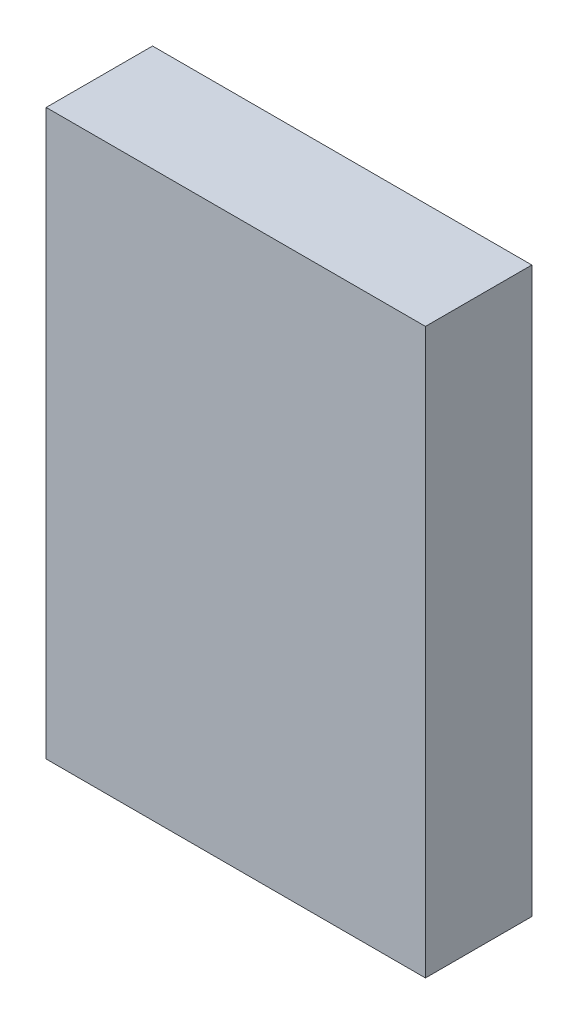
ISO-10303-21;
HEADER;
FILE_DESCRIPTION(('STEP AP214'),'2;1');
FILE_NAME('part.step','',(''),(''),'','','');
FILE_SCHEMA(('AUTOMOTIVE_DESIGN { 1 0 10303 214 1 1 1 1 }'));
ENDSEC;
DATA;
#1=APPLICATION_CONTEXT('core data for automotive mechanical design processes');
#2=APPLICATION_PROTOCOL_DEFINITION('international standard','automotive_design',2000,#1);
#3=PRODUCT_CONTEXT('',#1,'mechanical');
#4=PRODUCT('Part','Part','',(#3));
#5=PRODUCT_RELATED_PRODUCT_CATEGORY('part','',(#4));
#6=PRODUCT_DEFINITION_FORMATION('','',#4);
#7=PRODUCT_DEFINITION_CONTEXT('part definition',#1,'design');
#8=PRODUCT_DEFINITION('design','',#6,#7);
#9=PRODUCT_DEFINITION_SHAPE('','',#8);
#10=(LENGTH_UNIT() NAMED_UNIT(*) SI_UNIT(.MILLI.,.METRE.));
#11=(NAMED_UNIT(*) PLANE_ANGLE_UNIT() SI_UNIT($,.RADIAN.));
#12=(NAMED_UNIT(*) SI_UNIT($,.STERADIAN.) SOLID_ANGLE_UNIT());
#13=UNCERTAINTY_MEASURE_WITH_UNIT(LENGTH_MEASURE(1.E-05),#10,'distance_accuracy_value','');
#14=(GEOMETRIC_REPRESENTATION_CONTEXT(3) GLOBAL_UNCERTAINTY_ASSIGNED_CONTEXT((#13)) GLOBAL_UNIT_ASSIGNED_CONTEXT((#10,
#11,#12)) REPRESENTATION_CONTEXT('',''));
#15=CARTESIAN_POINT('',(0.,0.,0.));
#16=DIRECTION('',(0.,0.,1.));
#17=DIRECTION('',(1.,0.,0.));
#18=AXIS2_PLACEMENT_3D('',#15,#16,#17);
#19=CARTESIAN_POINT('',(-41.,61.,-23.));
#20=DIRECTION('',(-1.,0.,0.));
#21=DIRECTION('',(0.,-1.,0.));
#22=AXIS2_PLACEMENT_3D('',#19,#20,#21);
#23=PLANE('',#22);
#24=DIRECTION('',(0.,-1.,0.));
#25=VECTOR('',#24,1.);
#26=CARTESIAN_POINT('',(-41.,61.,0.));
#27=LINE('',#26,#25);
#28=CARTESIAN_POINT('',(-41.,61.,0.));
#29=VERTEX_POINT('',#28);
#30=CARTESIAN_POINT('',(-41.,-61.,0.));
#31=VERTEX_POINT('',#30);
#32=EDGE_CURVE('E189',#29,#31,#27,.T.);
#33=ORIENTED_EDGE('',*,*,#32,.F.);
#34=DIRECTION('',(0.,0.,1.));
#35=VECTOR('',#34,1.);
#36=CARTESIAN_POINT('',(-41.,61.,-23.));
#37=LINE('',#36,#35);
#38=CARTESIAN_POINT('',(-41.,61.,-23.));
#39=VERTEX_POINT('',#38);
#40=EDGE_CURVE('E42',#39,#29,#37,.T.);
#41=ORIENTED_EDGE('',*,*,#40,.F.);
#42=DIRECTION('',(0.,-1.,0.));
#43=VECTOR('',#42,1.);
#44=CARTESIAN_POINT('',(-41.,61.,-23.));
#45=LINE('',#44,#43);
#46=CARTESIAN_POINT('',(-41.,-61.,-23.));
#47=VERTEX_POINT('',#46);
#48=EDGE_CURVE('E190',#39,#47,#45,.T.);
#49=ORIENTED_EDGE('',*,*,#48,.T.);
#50=DIRECTION('',(0.,0.,1.));
#51=VECTOR('',#50,1.);
#52=CARTESIAN_POINT('',(-41.,-61.,-23.));
#53=LINE('',#52,#51);
#54=EDGE_CURVE('E203',#47,#31,#53,.T.);
#55=ORIENTED_EDGE('',*,*,#54,.T.);
#56=EDGE_LOOP('',(#33,#41,#49,#55));
#57=FACE_BOUND('',#56,.T.);
#58=ADVANCED_FACE('F35',(#57),#23,.T.);
#59=CARTESIAN_POINT('',(-41.,61.,-23.));
#60=DIRECTION('',(0.,1.,0.));
#61=DIRECTION('',(0.,0.,1.));
#62=AXIS2_PLACEMENT_3D('',#59,#60,#61);
#63=PLANE('',#62);
#64=DIRECTION('',(-1.,0.,0.));
#65=VECTOR('',#64,1.);
#66=CARTESIAN_POINT('',(-41.,61.,0.));
#67=LINE('',#66,#65);
#68=CARTESIAN_POINT('',(41.,61.,0.));
#69=VERTEX_POINT('',#68);
#70=EDGE_CURVE('E194',#69,#29,#67,.T.);
#71=ORIENTED_EDGE('',*,*,#70,.F.);
#72=DIRECTION('',(0.,0.,1.));
#73=VECTOR('',#72,1.);
#74=CARTESIAN_POINT('',(41.,61.,-23.));
#75=LINE('',#74,#73);
#76=CARTESIAN_POINT('',(41.,61.,-23.));
#77=VERTEX_POINT('',#76);
#78=EDGE_CURVE('E215',#77,#69,#75,.T.);
#79=ORIENTED_EDGE('',*,*,#78,.F.);
#80=DIRECTION('',(-1.,0.,0.));
#81=VECTOR('',#80,1.);
#82=CARTESIAN_POINT('',(-41.,61.,-23.));
#83=LINE('',#82,#81);
#84=EDGE_CURVE('E200',#77,#39,#83,.T.);
#85=ORIENTED_EDGE('',*,*,#84,.T.);
#86=ORIENTED_EDGE('',*,*,#40,.T.);
#87=EDGE_LOOP('',(#71,#79,#85,#86));
#88=FACE_BOUND('',#87,.T.);
#89=ADVANCED_FACE('F230',(#88),#63,.T.);
#90=CARTESIAN_POINT('',(41.,61.,-23.));
#91=DIRECTION('',(1.,0.,0.));
#92=DIRECTION('',(0.,1.,0.));
#93=AXIS2_PLACEMENT_3D('',#90,#91,#92);
#94=PLANE('',#93);
#95=DIRECTION('',(0.,1.,0.));
#96=VECTOR('',#95,1.);
#97=CARTESIAN_POINT('',(41.,61.,0.));
#98=LINE('',#97,#96);
#99=CARTESIAN_POINT('',(41.,-61.,0.));
#100=VERTEX_POINT('',#99);
#101=EDGE_CURVE('E209',#100,#69,#98,.T.);
#102=ORIENTED_EDGE('',*,*,#101,.F.);
#103=DIRECTION('',(0.,0.,1.));
#104=VECTOR('',#103,1.);
#105=CARTESIAN_POINT('',(41.,-61.,-23.));
#106=LINE('',#105,#104);
#107=CARTESIAN_POINT('',(41.,-61.,-23.));
#108=VERTEX_POINT('',#107);
#109=EDGE_CURVE('E217',#108,#100,#106,.T.);
#110=ORIENTED_EDGE('',*,*,#109,.F.);
#111=DIRECTION('',(0.,1.,0.));
#112=VECTOR('',#111,1.);
#113=CARTESIAN_POINT('',(41.,61.,-23.));
#114=LINE('',#113,#112);
#115=EDGE_CURVE('E197',#108,#77,#114,.T.);
#116=ORIENTED_EDGE('',*,*,#115,.T.);
#117=ORIENTED_EDGE('',*,*,#78,.T.);
#118=EDGE_LOOP('',(#102,#110,#116,#117));
#119=FACE_BOUND('',#118,.T.);
#120=ADVANCED_FACE('F236',(#119),#94,.T.);
#121=CARTESIAN_POINT('',(-41.,-61.,-23.));
#122=DIRECTION('',(0.,-1.,0.));
#123=DIRECTION('',(0.,0.,-1.));
#124=AXIS2_PLACEMENT_3D('',#121,#122,#123);
#125=PLANE('',#124);
#126=DIRECTION('',(1.,0.,0.));
#127=VECTOR('',#126,1.);
#128=CARTESIAN_POINT('',(-41.,-61.,0.));
#129=LINE('',#128,#127);
#130=EDGE_CURVE('E206',#31,#100,#129,.T.);
#131=ORIENTED_EDGE('',*,*,#130,.F.);
#132=ORIENTED_EDGE('',*,*,#54,.F.);
#133=DIRECTION('',(1.,0.,0.));
#134=VECTOR('',#133,1.);
#135=CARTESIAN_POINT('',(-41.,-61.,-23.));
#136=LINE('',#135,#134);
#137=EDGE_CURVE('E193',#47,#108,#136,.T.);
#138=ORIENTED_EDGE('',*,*,#137,.T.);
#139=ORIENTED_EDGE('',*,*,#109,.T.);
#140=EDGE_LOOP('',(#131,#132,#138,#139));
#141=FACE_BOUND('',#140,.T.);
#142=ADVANCED_FACE('F224',(#141),#125,.T.);
#143=CARTESIAN_POINT('',(0.,0.,-23.));
#144=DIRECTION('',(0.,0.,1.));
#145=DIRECTION('',(1.,0.,0.));
#146=AXIS2_PLACEMENT_3D('',#143,#144,#145);
#147=PLANE('',#146);
#148=DIRECTION('',(-1.,0.,0.));
#149=VECTOR('',#148,1.);
#150=CARTESIAN_POINT('',(39.,-59.,-23.));
#151=LINE('',#150,#149);
#152=CARTESIAN_POINT('',(39.,-59.,-23.));
#153=VERTEX_POINT('',#152);
#154=CARTESIAN_POINT('',(-39.,-59.,-23.));
#155=VERTEX_POINT('',#154);
#156=EDGE_CURVE('E151',#153,#155,#151,.T.);
#157=ORIENTED_EDGE('',*,*,#156,.F.);
#158=DIRECTION('',(0.,-1.,0.));
#159=VECTOR('',#158,1.);
#160=CARTESIAN_POINT('',(39.,59.,-23.));
#161=LINE('',#160,#159);
#162=CARTESIAN_POINT('',(39.,59.,-23.));
#163=VERTEX_POINT('',#162);
#164=EDGE_CURVE('E49',#163,#153,#161,.T.);
#165=ORIENTED_EDGE('',*,*,#164,.F.);
#166=DIRECTION('',(1.,0.,0.));
#167=VECTOR('',#166,1.);
#168=CARTESIAN_POINT('',(39.,59.,-23.));
#169=LINE('',#168,#167);
#170=CARTESIAN_POINT('',(-39.,59.,-23.));
#171=VERTEX_POINT('',#170);
#172=EDGE_CURVE('E142',#171,#163,#169,.T.);
#173=ORIENTED_EDGE('',*,*,#172,.F.);
#174=DIRECTION('',(0.,1.,0.));
#175=VECTOR('',#174,1.);
#176=CARTESIAN_POINT('',(-39.,59.,-23.));
#177=LINE('',#176,#175);
#178=EDGE_CURVE('E145',#155,#171,#177,.T.);
#179=ORIENTED_EDGE('',*,*,#178,.F.);
#180=EDGE_LOOP('',(#157,#165,#173,#179));
#181=FACE_BOUND('',#180,.T.);
#182=ORIENTED_EDGE('',*,*,#48,.F.);
#183=ORIENTED_EDGE('',*,*,#84,.F.);
#184=ORIENTED_EDGE('',*,*,#115,.F.);
#185=ORIENTED_EDGE('',*,*,#137,.F.);
#186=EDGE_LOOP('',(#182,#183,#184,#185));
#187=FACE_BOUND('',#186,.T.);
#188=ADVANCED_FACE('F233',(#181,#187),#147,.F.);
#189=CARTESIAN_POINT('',(0.,0.,0.));
#190=DIRECTION('',(0.,0.,1.));
#191=DIRECTION('',(1.,0.,0.));
#192=AXIS2_PLACEMENT_3D('',#189,#190,#191);
#193=PLANE('',#192);
#194=ORIENTED_EDGE('',*,*,#32,.T.);
#195=ORIENTED_EDGE('',*,*,#130,.T.);
#196=ORIENTED_EDGE('',*,*,#101,.T.);
#197=ORIENTED_EDGE('',*,*,#70,.T.);
#198=EDGE_LOOP('',(#194,#195,#196,#197));
#199=FACE_BOUND('',#198,.T.);
#200=ADVANCED_FACE('F227',(#199),#193,.T.);
#201=CARTESIAN_POINT('',(0.,0.,-21.));
#202=DIRECTION('',(0.,0.,-1.));
#203=DIRECTION('',(-1.,0.,0.));
#204=AXIS2_PLACEMENT_3D('',#201,#202,#203);
#205=PLANE('',#204);
#206=DIRECTION('',(0.,-1.,0.));
#207=VECTOR('',#206,1.);
#208=CARTESIAN_POINT('',(39.,59.,-21.));
#209=LINE('',#208,#207);
#210=CARTESIAN_POINT('',(39.,59.,-21.));
#211=VERTEX_POINT('',#210);
#212=CARTESIAN_POINT('',(39.,-59.,-21.));
#213=VERTEX_POINT('',#212);
#214=EDGE_CURVE('E124',#211,#213,#209,.T.);
#215=ORIENTED_EDGE('',*,*,#214,.T.);
#216=DIRECTION('',(-1.,0.,0.));
#217=VECTOR('',#216,1.);
#218=CARTESIAN_POINT('',(39.,-59.,-21.));
#219=LINE('',#218,#217);
#220=CARTESIAN_POINT('',(-39.,-59.,-21.));
#221=VERTEX_POINT('',#220);
#222=EDGE_CURVE('E133',#213,#221,#219,.T.);
#223=ORIENTED_EDGE('',*,*,#222,.T.);
#224=DIRECTION('',(0.,1.,0.));
#225=VECTOR('',#224,1.);
#226=CARTESIAN_POINT('',(-39.,59.,-21.));
#227=LINE('',#226,#225);
#228=CARTESIAN_POINT('',(-39.,59.,-21.));
#229=VERTEX_POINT('',#228);
#230=EDGE_CURVE('E138',#221,#229,#227,.T.);
#231=ORIENTED_EDGE('',*,*,#230,.T.);
#232=DIRECTION('',(1.,0.,0.));
#233=VECTOR('',#232,1.);
#234=CARTESIAN_POINT('',(39.,59.,-21.));
#235=LINE('',#234,#233);
#236=EDGE_CURVE('E130',#229,#211,#235,.T.);
#237=ORIENTED_EDGE('',*,*,#236,.T.);
#238=EDGE_LOOP('',(#215,#223,#231,#237));
#239=FACE_BOUND('',#238,.T.);
#240=DIRECTION('',(-1.,0.,0.));
#241=VECTOR('',#240,1.);
#242=CARTESIAN_POINT('',(38.,58.,-21.));
#243=LINE('',#242,#241);
#244=CARTESIAN_POINT('',(38.,58.,-21.));
#245=VERTEX_POINT('',#244);
#246=CARTESIAN_POINT('',(-38.,58.,-21.));
#247=VERTEX_POINT('',#246);
#248=EDGE_CURVE('E56',#245,#247,#243,.T.);
#249=ORIENTED_EDGE('',*,*,#248,.T.);
#250=DIRECTION('',(0.,-1.,0.));
#251=VECTOR('',#250,1.);
#252=CARTESIAN_POINT('',(-38.,58.,-21.));
#253=LINE('',#252,#251);
#254=CARTESIAN_POINT('',(-38.,-58.,-21.));
#255=VERTEX_POINT('',#254);
#256=EDGE_CURVE('E12',#247,#255,#253,.T.);
#257=ORIENTED_EDGE('',*,*,#256,.T.);
#258=DIRECTION('',(1.,0.,0.));
#259=VECTOR('',#258,1.);
#260=CARTESIAN_POINT('',(38.,-58.,-21.));
#261=LINE('',#260,#259);
#262=CARTESIAN_POINT('',(38.,-58.,-21.));
#263=VERTEX_POINT('',#262);
#264=EDGE_CURVE('E157',#255,#263,#261,.T.);
#265=ORIENTED_EDGE('',*,*,#264,.T.);
#266=DIRECTION('',(0.,1.,0.));
#267=VECTOR('',#266,1.);
#268=CARTESIAN_POINT('',(38.,58.,-21.));
#269=LINE('',#268,#267);
#270=EDGE_CURVE('E162',#263,#245,#269,.T.);
#271=ORIENTED_EDGE('',*,*,#270,.T.);
#272=EDGE_LOOP('',(#249,#257,#265,#271));
#273=FACE_BOUND('',#272,.T.);
#274=ADVANCED_FACE('F140',(#239,#273),#205,.T.);
#275=CARTESIAN_POINT('',(39.,59.,-21.));
#276=DIRECTION('',(1.,0.,0.));
#277=DIRECTION('',(0.,1.,0.));
#278=AXIS2_PLACEMENT_3D('',#275,#276,#277);
#279=PLANE('',#278);
#280=ORIENTED_EDGE('',*,*,#164,.T.);
#281=DIRECTION('',(0.,0.,-1.));
#282=VECTOR('',#281,1.);
#283=CARTESIAN_POINT('',(39.,-59.,-21.));
#284=LINE('',#283,#282);
#285=EDGE_CURVE('E120',#213,#153,#284,.T.);
#286=ORIENTED_EDGE('',*,*,#285,.F.);
#287=ORIENTED_EDGE('',*,*,#214,.F.);
#288=DIRECTION('',(0.,0.,-1.));
#289=VECTOR('',#288,1.);
#290=CARTESIAN_POINT('',(39.,59.,-21.));
#291=LINE('',#290,#289);
#292=EDGE_CURVE('E155',#211,#163,#291,.T.);
#293=ORIENTED_EDGE('',*,*,#292,.T.);
#294=EDGE_LOOP('',(#280,#286,#287,#293));
#295=FACE_BOUND('',#294,.T.);
#296=ADVANCED_FACE('F122',(#295),#279,.F.);
#297=CARTESIAN_POINT('',(39.,59.,-21.));
#298=DIRECTION('',(0.,1.,0.));
#299=DIRECTION('',(0.,0.,1.));
#300=AXIS2_PLACEMENT_3D('',#297,#298,#299);
#301=PLANE('',#300);
#302=ORIENTED_EDGE('',*,*,#172,.T.);
#303=ORIENTED_EDGE('',*,*,#292,.F.);
#304=ORIENTED_EDGE('',*,*,#236,.F.);
#305=DIRECTION('',(0.,0.,-1.));
#306=VECTOR('',#305,1.);
#307=CARTESIAN_POINT('',(-39.,59.,-21.));
#308=LINE('',#307,#306);
#309=EDGE_CURVE('E158',#229,#171,#308,.T.);
#310=ORIENTED_EDGE('',*,*,#309,.T.);
#311=EDGE_LOOP('',(#302,#303,#304,#310));
#312=FACE_BOUND('',#311,.T.);
#313=ADVANCED_FACE('F310',(#312),#301,.F.);
#314=CARTESIAN_POINT('',(-39.,59.,-21.));
#315=DIRECTION('',(-1.,0.,0.));
#316=DIRECTION('',(0.,-1.,0.));
#317=AXIS2_PLACEMENT_3D('',#314,#315,#316);
#318=PLANE('',#317);
#319=ORIENTED_EDGE('',*,*,#178,.T.);
#320=ORIENTED_EDGE('',*,*,#309,.F.);
#321=ORIENTED_EDGE('',*,*,#230,.F.);
#322=DIRECTION('',(0.,0.,-1.));
#323=VECTOR('',#322,1.);
#324=CARTESIAN_POINT('',(-39.,-59.,-21.));
#325=LINE('',#324,#323);
#326=EDGE_CURVE('E129',#221,#155,#325,.T.);
#327=ORIENTED_EDGE('',*,*,#326,.T.);
#328=EDGE_LOOP('',(#319,#320,#321,#327));
#329=FACE_BOUND('',#328,.T.);
#330=ADVANCED_FACE('F319',(#329),#318,.F.);
#331=CARTESIAN_POINT('',(39.,-59.,-21.));
#332=DIRECTION('',(0.,-1.,0.));
#333=DIRECTION('',(0.,0.,-1.));
#334=AXIS2_PLACEMENT_3D('',#331,#332,#333);
#335=PLANE('',#334);
#336=ORIENTED_EDGE('',*,*,#156,.T.);
#337=ORIENTED_EDGE('',*,*,#326,.F.);
#338=ORIENTED_EDGE('',*,*,#222,.F.);
#339=ORIENTED_EDGE('',*,*,#285,.T.);
#340=EDGE_LOOP('',(#336,#337,#338,#339));
#341=FACE_BOUND('',#340,.T.);
#342=ADVANCED_FACE('F134',(#341),#335,.F.);
#343=CARTESIAN_POINT('',(0.,0.,-2.));
#344=DIRECTION('',(0.,0.,1.));
#345=DIRECTION('',(1.,0.,0.));
#346=AXIS2_PLACEMENT_3D('',#343,#344,#345);
#347=PLANE('',#346);
#348=DIRECTION('',(0.,1.,0.));
#349=VECTOR('',#348,1.);
#350=CARTESIAN_POINT('',(-38.,58.,-2.));
#351=LINE('',#350,#349);
#352=CARTESIAN_POINT('',(-38.,-58.,-2.));
#353=VERTEX_POINT('',#352);
#354=CARTESIAN_POINT('',(-38.,58.,-2.));
#355=VERTEX_POINT('',#354);
#356=EDGE_CURVE('E169',#353,#355,#351,.T.);
#357=ORIENTED_EDGE('',*,*,#356,.T.);
#358=DIRECTION('',(1.,0.,0.));
#359=VECTOR('',#358,1.);
#360=CARTESIAN_POINT('',(38.,58.,-2.));
#361=LINE('',#360,#359);
#362=CARTESIAN_POINT('',(38.,58.,-2.));
#363=VERTEX_POINT('',#362);
#364=EDGE_CURVE('E165',#355,#363,#361,.T.);
#365=ORIENTED_EDGE('',*,*,#364,.T.);
#366=DIRECTION('',(0.,-1.,0.));
#367=VECTOR('',#366,1.);
#368=CARTESIAN_POINT('',(38.,58.,-2.));
#369=LINE('',#368,#367);
#370=CARTESIAN_POINT('',(38.,-58.,-2.));
#371=VERTEX_POINT('',#370);
#372=EDGE_CURVE('E178',#363,#371,#369,.T.);
#373=ORIENTED_EDGE('',*,*,#372,.T.);
#374=DIRECTION('',(-1.,0.,0.));
#375=VECTOR('',#374,1.);
#376=CARTESIAN_POINT('',(38.,-58.,-2.));
#377=LINE('',#376,#375);
#378=EDGE_CURVE('E174',#371,#353,#377,.T.);
#379=ORIENTED_EDGE('',*,*,#378,.T.);
#380=EDGE_LOOP('',(#357,#365,#373,#379));
#381=FACE_BOUND('',#380,.T.);
#382=ADVANCED_FACE('F278',(#381),#347,.F.);
#383=CARTESIAN_POINT('',(-38.,58.,138.679486586878));
#384=DIRECTION('',(-1.,0.,0.));
#385=DIRECTION('',(0.,-1.,0.));
#386=AXIS2_PLACEMENT_3D('',#383,#384,#385);
#387=PLANE('',#386);
#388=ORIENTED_EDGE('',*,*,#256,.F.);
#389=DIRECTION('',(0.,0.,-1.));
#390=VECTOR('',#389,1.);
#391=CARTESIAN_POINT('',(-38.,58.,138.679486586878));
#392=LINE('',#391,#390);
#393=EDGE_CURVE('E172',#355,#247,#392,.T.);
#394=ORIENTED_EDGE('',*,*,#393,.F.);
#395=ORIENTED_EDGE('',*,*,#356,.F.);
#396=DIRECTION('',(0.,0.,-1.));
#397=VECTOR('',#396,1.);
#398=CARTESIAN_POINT('',(-38.,-58.,138.679486586878));
#399=LINE('',#398,#397);
#400=EDGE_CURVE('E173',#353,#255,#399,.T.);
#401=ORIENTED_EDGE('',*,*,#400,.T.);
#402=EDGE_LOOP('',(#388,#394,#395,#401));
#403=FACE_BOUND('',#402,.T.);
#404=ADVANCED_FACE('F282',(#403),#387,.F.);
#405=CARTESIAN_POINT('',(38.,-58.,138.679486586878));
#406=DIRECTION('',(0.,-1.,0.));
#407=DIRECTION('',(1.,0.,0.));
#408=AXIS2_PLACEMENT_3D('',#405,#406,#407);
#409=PLANE('',#408);
#410=ORIENTED_EDGE('',*,*,#264,.F.);
#411=ORIENTED_EDGE('',*,*,#400,.F.);
#412=ORIENTED_EDGE('',*,*,#378,.F.);
#413=DIRECTION('',(0.,0.,-1.));
#414=VECTOR('',#413,1.);
#415=CARTESIAN_POINT('',(38.,-58.,138.679486586878));
#416=LINE('',#415,#414);
#417=EDGE_CURVE('E177',#371,#263,#416,.T.);
#418=ORIENTED_EDGE('',*,*,#417,.T.);
#419=EDGE_LOOP('',(#410,#411,#412,#418));
#420=FACE_BOUND('',#419,.T.);
#421=ADVANCED_FACE('F343',(#420),#409,.F.);
#422=CARTESIAN_POINT('',(38.,58.,138.679486586878));
#423=DIRECTION('',(1.,0.,0.));
#424=DIRECTION('',(0.,1.,0.));
#425=AXIS2_PLACEMENT_3D('',#422,#423,#424);
#426=PLANE('',#425);
#427=ORIENTED_EDGE('',*,*,#270,.F.);
#428=ORIENTED_EDGE('',*,*,#417,.F.);
#429=ORIENTED_EDGE('',*,*,#372,.F.);
#430=DIRECTION('',(0.,0.,-1.));
#431=VECTOR('',#430,1.);
#432=CARTESIAN_POINT('',(38.,58.,138.679486586878));
#433=LINE('',#432,#431);
#434=EDGE_CURVE('E168',#363,#245,#433,.T.);
#435=ORIENTED_EDGE('',*,*,#434,.T.);
#436=EDGE_LOOP('',(#427,#428,#429,#435));
#437=FACE_BOUND('',#436,.T.);
#438=ADVANCED_FACE('F353',(#437),#426,.F.);
#439=CARTESIAN_POINT('',(38.,58.,138.679486586878));
#440=DIRECTION('',(0.,1.,0.));
#441=DIRECTION('',(-1.,0.,0.));
#442=AXIS2_PLACEMENT_3D('',#439,#440,#441);
#443=PLANE('',#442);
#444=ORIENTED_EDGE('',*,*,#248,.F.);
#445=ORIENTED_EDGE('',*,*,#434,.F.);
#446=ORIENTED_EDGE('',*,*,#364,.F.);
#447=ORIENTED_EDGE('',*,*,#393,.T.);
#448=EDGE_LOOP('',(#444,#445,#446,#447));
#449=FACE_BOUND('',#448,.T.);
#450=ADVANCED_FACE('F363',(#449),#443,.F.);
#451=CLOSED_SHELL('',(#58,#89,#120,#142,#188,#200,#274,#296,#313,#330,#342,#382,#404,#421,#438,#450));
#452=MANIFOLD_SOLID_BREP('B2',#451);
#453=ADVANCED_BREP_SHAPE_REPRESENTATION('',(#18,#452),#14);
#454=SHAPE_DEFINITION_REPRESENTATION(#9,#453);
ENDSEC;
END-ISO-10303-21;
